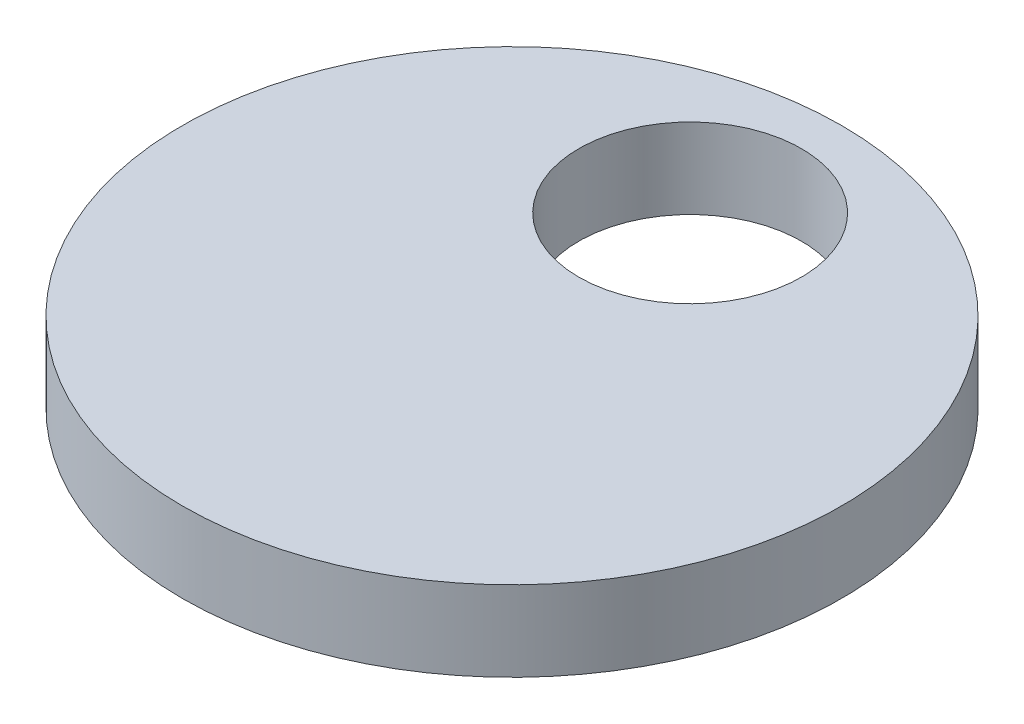
ISO-10303-21;
HEADER;
FILE_DESCRIPTION(('STEP AP214'),'2;1');
FILE_NAME('part.step','',(''),(''),'','','');
FILE_SCHEMA(('AUTOMOTIVE_DESIGN { 1 0 10303 214 1 1 1 1 }'));
ENDSEC;
DATA;
#1=APPLICATION_CONTEXT('core data for automotive mechanical design processes');
#2=APPLICATION_PROTOCOL_DEFINITION('international standard','automotive_design',2000,#1);
#3=PRODUCT_CONTEXT('',#1,'mechanical');
#4=PRODUCT('Part','Part','',(#3));
#5=PRODUCT_RELATED_PRODUCT_CATEGORY('part','',(#4));
#6=PRODUCT_DEFINITION_FORMATION('','',#4);
#7=PRODUCT_DEFINITION_CONTEXT('part definition',#1,'design');
#8=PRODUCT_DEFINITION('design','',#6,#7);
#9=PRODUCT_DEFINITION_SHAPE('','',#8);
#10=(LENGTH_UNIT() NAMED_UNIT(*) SI_UNIT(.MILLI.,.METRE.));
#11=(NAMED_UNIT(*) PLANE_ANGLE_UNIT() SI_UNIT($,.RADIAN.));
#12=(NAMED_UNIT(*) SI_UNIT($,.STERADIAN.) SOLID_ANGLE_UNIT());
#13=UNCERTAINTY_MEASURE_WITH_UNIT(LENGTH_MEASURE(1.E-05),#10,'distance_accuracy_value','');
#14=(GEOMETRIC_REPRESENTATION_CONTEXT(3) GLOBAL_UNCERTAINTY_ASSIGNED_CONTEXT((#13)) GLOBAL_UNIT_ASSIGNED_CONTEXT((#10,
#11,#12)) REPRESENTATION_CONTEXT('',''));
#15=CARTESIAN_POINT('',(0.,0.,0.));
#16=DIRECTION('',(0.,0.,1.));
#17=DIRECTION('',(1.,0.,0.));
#18=AXIS2_PLACEMENT_3D('',#15,#16,#17);
#19=CARTESIAN_POINT('',(0.,1.8,0.));
#20=DIRECTION('',(0.,-1.,0.));
#21=DIRECTION('',(0.,0.,-1.));
#22=AXIS2_PLACEMENT_3D('',#19,#20,#21);
#23=CYLINDRICAL_SURFACE('',#22,7.4);
#24=CARTESIAN_POINT('',(0.,1.8,0.));
#25=DIRECTION('',(0.,1.,0.));
#26=DIRECTION('',(0.,0.,1.));
#27=AXIS2_PLACEMENT_3D('',#24,#25,#26);
#28=CIRCLE('',#27,7.4);
#29=CARTESIAN_POINT('',(0.,1.8,7.4));
#30=VERTEX_POINT('',#29);
#31=EDGE_CURVE('E10',#30,#30,#28,.T.);
#32=ORIENTED_EDGE('',*,*,#31,.F.);
#33=EDGE_LOOP('',(#32));
#34=FACE_BOUND('',#33,.T.);
#35=CARTESIAN_POINT('',(0.,0.,0.));
#36=DIRECTION('',(0.,1.,0.));
#37=DIRECTION('',(0.,0.,1.));
#38=AXIS2_PLACEMENT_3D('',#35,#36,#37);
#39=CIRCLE('',#38,7.4);
#40=CARTESIAN_POINT('',(0.,0.,7.4));
#41=VERTEX_POINT('',#40);
#42=EDGE_CURVE('E40',#41,#41,#39,.T.);
#43=ORIENTED_EDGE('',*,*,#42,.T.);
#44=EDGE_LOOP('',(#43));
#45=FACE_BOUND('',#44,.T.);
#46=ADVANCED_FACE('F37',(#34,#45),#23,.T.);
#47=CARTESIAN_POINT('',(0.,1.8,0.));
#48=DIRECTION('',(0.,1.,0.));
#49=DIRECTION('',(0.,0.,1.));
#50=AXIS2_PLACEMENT_3D('',#47,#48,#49);
#51=PLANE('',#50);
#52=CARTESIAN_POINT('',(0.,1.8,-4.));
#53=DIRECTION('',(0.,1.,0.));
#54=DIRECTION('',(0.,0.,1.));
#55=AXIS2_PLACEMENT_3D('',#52,#53,#54);
#56=CIRCLE('',#55,2.5);
#57=CARTESIAN_POINT('',(0.,1.8,-1.5));
#58=VERTEX_POINT('',#57);
#59=EDGE_CURVE('E51',#58,#58,#56,.T.);
#60=ORIENTED_EDGE('',*,*,#59,.F.);
#61=EDGE_LOOP('',(#60));
#62=FACE_BOUND('',#61,.T.);
#63=ORIENTED_EDGE('',*,*,#31,.T.);
#64=EDGE_LOOP('',(#63));
#65=FACE_BOUND('',#64,.T.);
#66=ADVANCED_FACE('F68',(#62,#65),#51,.T.);
#67=CARTESIAN_POINT('',(0.,0.,0.));
#68=DIRECTION('',(0.,1.,0.));
#69=DIRECTION('',(0.,0.,1.));
#70=AXIS2_PLACEMENT_3D('',#67,#68,#69);
#71=PLANE('',#70);
#72=CARTESIAN_POINT('',(0.,0.,-4.));
#73=DIRECTION('',(0.,1.,0.));
#74=DIRECTION('',(0.,0.,1.));
#75=AXIS2_PLACEMENT_3D('',#72,#73,#74);
#76=CIRCLE('',#75,2.5);
#77=CARTESIAN_POINT('',(0.,0.,-1.5));
#78=VERTEX_POINT('',#77);
#79=EDGE_CURVE('E49',#78,#78,#76,.T.);
#80=ORIENTED_EDGE('',*,*,#79,.T.);
#81=EDGE_LOOP('',(#80));
#82=FACE_BOUND('',#81,.T.);
#83=ORIENTED_EDGE('',*,*,#42,.F.);
#84=EDGE_LOOP('',(#83));
#85=FACE_BOUND('',#84,.T.);
#86=ADVANCED_FACE('F59',(#82,#85),#71,.F.);
#87=CARTESIAN_POINT('',(0.,0.,-4.));
#88=DIRECTION('',(0.,1.,0.));
#89=DIRECTION('',(0.,0.,1.));
#90=AXIS2_PLACEMENT_3D('',#87,#88,#89);
#91=CYLINDRICAL_SURFACE('',#90,2.5);
#92=ORIENTED_EDGE('',*,*,#79,.F.);
#93=EDGE_LOOP('',(#92));
#94=FACE_BOUND('',#93,.T.);
#95=ORIENTED_EDGE('',*,*,#59,.T.);
#96=EDGE_LOOP('',(#95));
#97=FACE_BOUND('',#96,.T.);
#98=ADVANCED_FACE('F62',(#94,#97),#91,.F.);
#99=CLOSED_SHELL('',(#46,#66,#86,#98));
#100=MANIFOLD_SOLID_BREP('B2',#99);
#101=ADVANCED_BREP_SHAPE_REPRESENTATION('',(#18,#100),#14);
#102=SHAPE_DEFINITION_REPRESENTATION(#9,#101);
ENDSEC;
END-ISO-10303-21;
